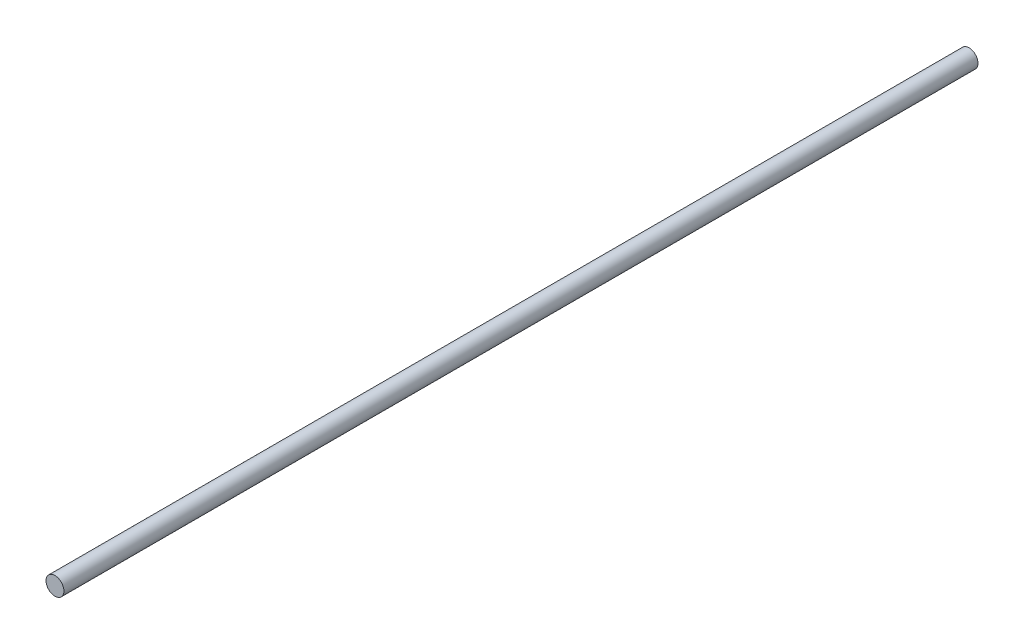
ISO-10303-21;
HEADER;
FILE_DESCRIPTION(('STEP AP214'),'2;1');
FILE_NAME('part.step','',(''),(''),'','','');
FILE_SCHEMA(('AUTOMOTIVE_DESIGN { 1 0 10303 214 1 1 1 1 }'));
ENDSEC;
DATA;
#1=APPLICATION_CONTEXT('core data for automotive mechanical design processes');
#2=APPLICATION_PROTOCOL_DEFINITION('international standard','automotive_design',2000,#1);
#3=PRODUCT_CONTEXT('',#1,'mechanical');
#4=PRODUCT('Part','Part','',(#3));
#5=PRODUCT_RELATED_PRODUCT_CATEGORY('part','',(#4));
#6=PRODUCT_DEFINITION_FORMATION('','',#4);
#7=PRODUCT_DEFINITION_CONTEXT('part definition',#1,'design');
#8=PRODUCT_DEFINITION('design','',#6,#7);
#9=PRODUCT_DEFINITION_SHAPE('','',#8);
#10=(LENGTH_UNIT() NAMED_UNIT(*) SI_UNIT(.MILLI.,.METRE.));
#11=(NAMED_UNIT(*) PLANE_ANGLE_UNIT() SI_UNIT($,.RADIAN.));
#12=(NAMED_UNIT(*) SI_UNIT($,.STERADIAN.) SOLID_ANGLE_UNIT());
#13=UNCERTAINTY_MEASURE_WITH_UNIT(LENGTH_MEASURE(1.E-05),#10,'distance_accuracy_value','');
#14=(GEOMETRIC_REPRESENTATION_CONTEXT(3) GLOBAL_UNCERTAINTY_ASSIGNED_CONTEXT((#13)) GLOBAL_UNIT_ASSIGNED_CONTEXT((#10,
#11,#12)) REPRESENTATION_CONTEXT('',''));
#15=CARTESIAN_POINT('',(0.,0.,0.));
#16=DIRECTION('',(0.,0.,1.));
#17=DIRECTION('',(1.,0.,0.));
#18=AXIS2_PLACEMENT_3D('',#15,#16,#17);
#19=CARTESIAN_POINT('',(239.941636038098,41.3740187810056,510.));
#20=DIRECTION('',(0.,0.,-1.));
#21=DIRECTION('',(0.,1.,0.));
#22=AXIS2_PLACEMENT_3D('',#19,#20,#21);
#23=CYLINDRICAL_SURFACE('',#22,5.);
#24=CARTESIAN_POINT('',(239.941636038098,41.3740187810056,510.));
#25=DIRECTION('',(0.,0.,1.));
#26=DIRECTION('',(0.,-1.,0.));
#27=AXIS2_PLACEMENT_3D('',#24,#25,#26);
#28=CIRCLE('',#27,5.);
#29=CARTESIAN_POINT('',(239.941636038098,36.3740187810056,510.));
#30=VERTEX_POINT('',#29);
#31=EDGE_CURVE('E10',#30,#30,#28,.T.);
#32=ORIENTED_EDGE('',*,*,#31,.F.);
#33=EDGE_LOOP('',(#32));
#34=FACE_BOUND('',#33,.T.);
#35=CARTESIAN_POINT('',(239.941636038098,41.3740187810056,0.));
#36=DIRECTION('',(0.,0.,1.));
#37=DIRECTION('',(0.,-1.,0.));
#38=AXIS2_PLACEMENT_3D('',#35,#36,#37);
#39=CIRCLE('',#38,5.);
#40=CARTESIAN_POINT('',(239.941636038098,36.3740187810056,0.));
#41=VERTEX_POINT('',#40);
#42=EDGE_CURVE('E36',#41,#41,#39,.T.);
#43=ORIENTED_EDGE('',*,*,#42,.T.);
#44=EDGE_LOOP('',(#43));
#45=FACE_BOUND('',#44,.T.);
#46=ADVANCED_FACE('F33',(#34,#45),#23,.T.);
#47=CARTESIAN_POINT('',(239.941636038098,41.3740187810056,510.));
#48=DIRECTION('',(0.,0.,1.));
#49=DIRECTION('',(0.,-1.,0.));
#50=AXIS2_PLACEMENT_3D('',#47,#48,#49);
#51=PLANE('',#50);
#52=ORIENTED_EDGE('',*,*,#31,.T.);
#53=EDGE_LOOP('',(#52));
#54=FACE_BOUND('',#53,.T.);
#55=ADVANCED_FACE('F48',(#54),#51,.T.);
#56=CARTESIAN_POINT('',(239.941636038098,41.3740187810056,0.));
#57=DIRECTION('',(0.,0.,1.));
#58=DIRECTION('',(0.,-1.,0.));
#59=AXIS2_PLACEMENT_3D('',#56,#57,#58);
#60=PLANE('',#59);
#61=ORIENTED_EDGE('',*,*,#42,.F.);
#62=EDGE_LOOP('',(#61));
#63=FACE_BOUND('',#62,.T.);
#64=ADVANCED_FACE('F46',(#63),#60,.F.);
#65=CLOSED_SHELL('',(#46,#55,#64));
#66=MANIFOLD_SOLID_BREP('B2',#65);
#67=ADVANCED_BREP_SHAPE_REPRESENTATION('',(#18,#66),#14);
#68=SHAPE_DEFINITION_REPRESENTATION(#9,#67);
ENDSEC;
END-ISO-10303-21;
